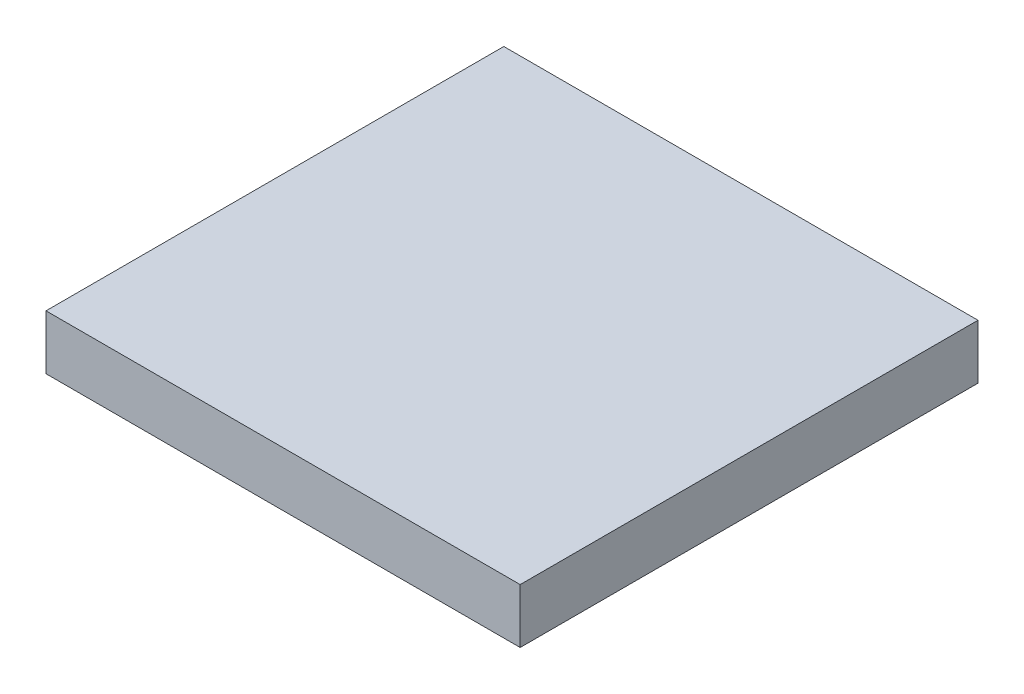
ISO-10303-21;
HEADER;
FILE_DESCRIPTION(('STEP AP214'),'2;1');
FILE_NAME('part.step','',(''),(''),'','','');
FILE_SCHEMA(('AUTOMOTIVE_DESIGN { 1 0 10303 214 1 1 1 1 }'));
ENDSEC;
DATA;
#1=APPLICATION_CONTEXT('core data for automotive mechanical design processes');
#2=APPLICATION_PROTOCOL_DEFINITION('international standard','automotive_design',2000,#1);
#3=PRODUCT_CONTEXT('',#1,'mechanical');
#4=PRODUCT('Part','Part','',(#3));
#5=PRODUCT_RELATED_PRODUCT_CATEGORY('part','',(#4));
#6=PRODUCT_DEFINITION_FORMATION('','',#4);
#7=PRODUCT_DEFINITION_CONTEXT('part definition',#1,'design');
#8=PRODUCT_DEFINITION('design','',#6,#7);
#9=PRODUCT_DEFINITION_SHAPE('','',#8);
#10=(LENGTH_UNIT() NAMED_UNIT(*) SI_UNIT(.MILLI.,.METRE.));
#11=(NAMED_UNIT(*) PLANE_ANGLE_UNIT() SI_UNIT($,.RADIAN.));
#12=(NAMED_UNIT(*) SI_UNIT($,.STERADIAN.) SOLID_ANGLE_UNIT());
#13=UNCERTAINTY_MEASURE_WITH_UNIT(LENGTH_MEASURE(1.E-05),#10,'distance_accuracy_value','');
#14=(GEOMETRIC_REPRESENTATION_CONTEXT(3) GLOBAL_UNCERTAINTY_ASSIGNED_CONTEXT((#13)) GLOBAL_UNIT_ASSIGNED_CONTEXT((#10,
#11,#12)) REPRESENTATION_CONTEXT('',''));
#15=CARTESIAN_POINT('',(0.,0.,0.));
#16=DIRECTION('',(0.,0.,1.));
#17=DIRECTION('',(1.,0.,0.));
#18=AXIS2_PLACEMENT_3D('',#15,#16,#17);
#19=CARTESIAN_POINT('',(43.5,10.,-42.));
#20=DIRECTION('',(-1.,0.,0.));
#21=DIRECTION('',(0.,0.,1.));
#22=AXIS2_PLACEMENT_3D('',#19,#20,#21);
#23=PLANE('',#22);
#24=DIRECTION('',(0.,0.,-1.));
#25=VECTOR('',#24,1.);
#26=CARTESIAN_POINT('',(43.5,0.,-42.));
#27=LINE('',#26,#25);
#28=CARTESIAN_POINT('',(43.5,0.,42.));
#29=VERTEX_POINT('',#28);
#30=CARTESIAN_POINT('',(43.5,0.,-42.));
#31=VERTEX_POINT('',#30);
#32=EDGE_CURVE('E96',#29,#31,#27,.T.);
#33=ORIENTED_EDGE('',*,*,#32,.T.);
#34=DIRECTION('',(0.,-1.,0.));
#35=VECTOR('',#34,1.);
#36=CARTESIAN_POINT('',(43.5,10.,-42.));
#37=LINE('',#36,#35);
#38=CARTESIAN_POINT('',(43.5,10.,-42.));
#39=VERTEX_POINT('',#38);
#40=EDGE_CURVE('E11',#39,#31,#37,.T.);
#41=ORIENTED_EDGE('',*,*,#40,.F.);
#42=DIRECTION('',(0.,0.,-1.));
#43=VECTOR('',#42,1.);
#44=CARTESIAN_POINT('',(43.5,10.,-42.));
#45=LINE('',#44,#43);
#46=CARTESIAN_POINT('',(43.5,10.,42.));
#47=VERTEX_POINT('',#46);
#48=EDGE_CURVE('E84',#47,#39,#45,.T.);
#49=ORIENTED_EDGE('',*,*,#48,.F.);
#50=DIRECTION('',(0.,-1.,0.));
#51=VECTOR('',#50,1.);
#52=CARTESIAN_POINT('',(43.5,10.,42.));
#53=LINE('',#52,#51);
#54=EDGE_CURVE('E92',#47,#29,#53,.T.);
#55=ORIENTED_EDGE('',*,*,#54,.T.);
#56=EDGE_LOOP('',(#33,#41,#49,#55));
#57=FACE_BOUND('',#56,.T.);
#58=ADVANCED_FACE('F33',(#57),#23,.F.);
#59=CARTESIAN_POINT('',(-43.5,10.,-42.));
#60=DIRECTION('',(0.,0.,1.));
#61=DIRECTION('',(1.,0.,0.));
#62=AXIS2_PLACEMENT_3D('',#59,#60,#61);
#63=PLANE('',#62);
#64=DIRECTION('',(-1.,0.,0.));
#65=VECTOR('',#64,1.);
#66=CARTESIAN_POINT('',(-43.5,0.,-42.));
#67=LINE('',#66,#65);
#68=CARTESIAN_POINT('',(-43.5,0.,-42.));
#69=VERTEX_POINT('',#68);
#70=EDGE_CURVE('E88',#31,#69,#67,.T.);
#71=ORIENTED_EDGE('',*,*,#70,.T.);
#72=DIRECTION('',(0.,-1.,0.));
#73=VECTOR('',#72,1.);
#74=CARTESIAN_POINT('',(-43.5,10.,-42.));
#75=LINE('',#74,#73);
#76=CARTESIAN_POINT('',(-43.5,10.,-42.));
#77=VERTEX_POINT('',#76);
#78=EDGE_CURVE('E41',#77,#69,#75,.T.);
#79=ORIENTED_EDGE('',*,*,#78,.F.);
#80=DIRECTION('',(-1.,0.,0.));
#81=VECTOR('',#80,1.);
#82=CARTESIAN_POINT('',(-43.5,10.,-42.));
#83=LINE('',#82,#81);
#84=EDGE_CURVE('E79',#39,#77,#83,.T.);
#85=ORIENTED_EDGE('',*,*,#84,.F.);
#86=ORIENTED_EDGE('',*,*,#40,.T.);
#87=EDGE_LOOP('',(#71,#79,#85,#86));
#88=FACE_BOUND('',#87,.T.);
#89=ADVANCED_FACE('F87',(#88),#63,.F.);
#90=CARTESIAN_POINT('',(-43.5,10.,-42.));
#91=DIRECTION('',(1.,0.,0.));
#92=DIRECTION('',(0.,0.,-1.));
#93=AXIS2_PLACEMENT_3D('',#90,#91,#92);
#94=PLANE('',#93);
#95=DIRECTION('',(0.,0.,1.));
#96=VECTOR('',#95,1.);
#97=CARTESIAN_POINT('',(-43.5,0.,-42.));
#98=LINE('',#97,#96);
#99=CARTESIAN_POINT('',(-43.5,0.,42.));
#100=VERTEX_POINT('',#99);
#101=EDGE_CURVE('E66',#69,#100,#98,.T.);
#102=ORIENTED_EDGE('',*,*,#101,.T.);
#103=DIRECTION('',(0.,-1.,0.));
#104=VECTOR('',#103,1.);
#105=CARTESIAN_POINT('',(-43.5,10.,42.));
#106=LINE('',#105,#104);
#107=CARTESIAN_POINT('',(-43.5,10.,42.));
#108=VERTEX_POINT('',#107);
#109=EDGE_CURVE('E89',#108,#100,#106,.T.);
#110=ORIENTED_EDGE('',*,*,#109,.F.);
#111=DIRECTION('',(0.,0.,1.));
#112=VECTOR('',#111,1.);
#113=CARTESIAN_POINT('',(-43.5,10.,-42.));
#114=LINE('',#113,#112);
#115=EDGE_CURVE('E82',#77,#108,#114,.T.);
#116=ORIENTED_EDGE('',*,*,#115,.F.);
#117=ORIENTED_EDGE('',*,*,#78,.T.);
#118=EDGE_LOOP('',(#102,#110,#116,#117));
#119=FACE_BOUND('',#118,.T.);
#120=ADVANCED_FACE('F90',(#119),#94,.F.);
#121=CARTESIAN_POINT('',(-43.5,10.,42.));
#122=DIRECTION('',(0.,0.,-1.));
#123=DIRECTION('',(-1.,0.,0.));
#124=AXIS2_PLACEMENT_3D('',#121,#122,#123);
#125=PLANE('',#124);
#126=DIRECTION('',(1.,0.,0.));
#127=VECTOR('',#126,1.);
#128=CARTESIAN_POINT('',(-43.5,0.,42.));
#129=LINE('',#128,#127);
#130=EDGE_CURVE('E72',#100,#29,#129,.T.);
#131=ORIENTED_EDGE('',*,*,#130,.T.);
#132=ORIENTED_EDGE('',*,*,#54,.F.);
#133=DIRECTION('',(1.,0.,0.));
#134=VECTOR('',#133,1.);
#135=CARTESIAN_POINT('',(-43.5,10.,42.));
#136=LINE('',#135,#134);
#137=EDGE_CURVE('E49',#108,#47,#136,.T.);
#138=ORIENTED_EDGE('',*,*,#137,.F.);
#139=ORIENTED_EDGE('',*,*,#109,.T.);
#140=EDGE_LOOP('',(#131,#132,#138,#139));
#141=FACE_BOUND('',#140,.T.);
#142=ADVANCED_FACE('F103',(#141),#125,.F.);
#143=CARTESIAN_POINT('',(0.,10.,0.));
#144=DIRECTION('',(0.,1.,0.));
#145=DIRECTION('',(0.,0.,1.));
#146=AXIS2_PLACEMENT_3D('',#143,#144,#145);
#147=PLANE('',#146);
#148=ORIENTED_EDGE('',*,*,#48,.T.);
#149=ORIENTED_EDGE('',*,*,#84,.T.);
#150=ORIENTED_EDGE('',*,*,#115,.T.);
#151=ORIENTED_EDGE('',*,*,#137,.T.);
#152=EDGE_LOOP('',(#148,#149,#150,#151));
#153=FACE_BOUND('',#152,.T.);
#154=ADVANCED_FACE('F80',(#153),#147,.T.);
#155=CARTESIAN_POINT('',(0.,0.,0.));
#156=DIRECTION('',(0.,1.,0.));
#157=DIRECTION('',(0.,0.,1.));
#158=AXIS2_PLACEMENT_3D('',#155,#156,#157);
#159=PLANE('',#158);
#160=ORIENTED_EDGE('',*,*,#32,.F.);
#161=ORIENTED_EDGE('',*,*,#130,.F.);
#162=ORIENTED_EDGE('',*,*,#101,.F.);
#163=ORIENTED_EDGE('',*,*,#70,.F.);
#164=EDGE_LOOP('',(#160,#161,#162,#163));
#165=FACE_BOUND('',#164,.T.);
#166=ADVANCED_FACE('F106',(#165),#159,.F.);
#167=CLOSED_SHELL('',(#58,#89,#120,#142,#154,#166));
#168=MANIFOLD_SOLID_BREP('B2',#167);
#169=ADVANCED_BREP_SHAPE_REPRESENTATION('',(#18,#168),#14);
#170=SHAPE_DEFINITION_REPRESENTATION(#9,#169);
ENDSEC;
END-ISO-10303-21;
